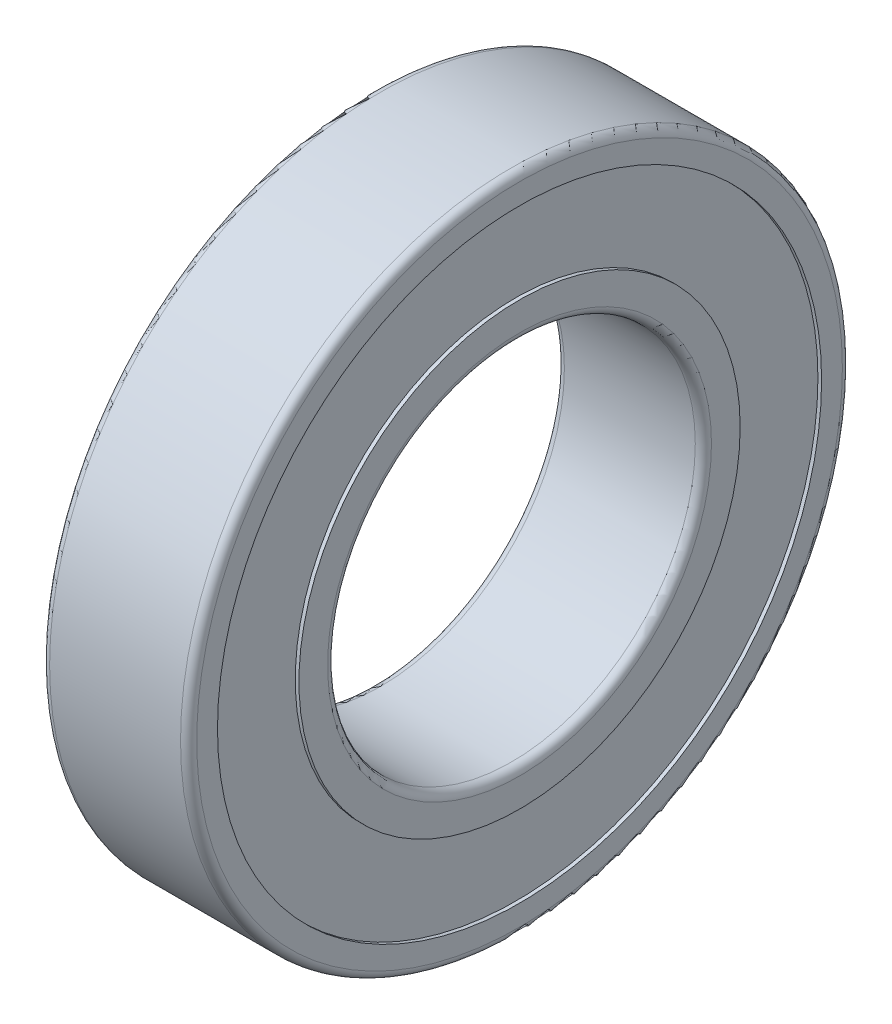
ISO-10303-21;
HEADER;
FILE_DESCRIPTION(('STEP AP214'),'2;1');
FILE_NAME('part.step','',(''),(''),'','','');
FILE_SCHEMA(('AUTOMOTIVE_DESIGN { 1 0 10303 214 1 1 1 1 }'));
ENDSEC;
DATA;
#1=APPLICATION_CONTEXT('core data for automotive mechanical design processes');
#2=APPLICATION_PROTOCOL_DEFINITION('international standard','automotive_design',2000,#1);
#3=PRODUCT_CONTEXT('',#1,'mechanical');
#4=PRODUCT('Part','Part','',(#3));
#5=PRODUCT_RELATED_PRODUCT_CATEGORY('part','',(#4));
#6=PRODUCT_DEFINITION_FORMATION('','',#4);
#7=PRODUCT_DEFINITION_CONTEXT('part definition',#1,'design');
#8=PRODUCT_DEFINITION('design','',#6,#7);
#9=PRODUCT_DEFINITION_SHAPE('','',#8);
#10=(LENGTH_UNIT() NAMED_UNIT(*) SI_UNIT(.MILLI.,.METRE.));
#11=(NAMED_UNIT(*) PLANE_ANGLE_UNIT() SI_UNIT($,.RADIAN.));
#12=(NAMED_UNIT(*) SI_UNIT($,.STERADIAN.) SOLID_ANGLE_UNIT());
#13=UNCERTAINTY_MEASURE_WITH_UNIT(LENGTH_MEASURE(1.E-05),#10,'distance_accuracy_value','');
#14=(GEOMETRIC_REPRESENTATION_CONTEXT(3) GLOBAL_UNCERTAINTY_ASSIGNED_CONTEXT((#13)) GLOBAL_UNIT_ASSIGNED_CONTEXT((#10,
#11,#12)) REPRESENTATION_CONTEXT('',''));
#15=CARTESIAN_POINT('',(0.,0.,0.));
#16=DIRECTION('',(0.,0.,1.));
#17=DIRECTION('',(1.,0.,0.));
#18=AXIS2_PLACEMENT_3D('',#15,#16,#17);
#19=CARTESIAN_POINT('',(0.,0.,0.));
#20=DIRECTION('',(-1.,0.,0.));
#21=DIRECTION('',(0.,0.,-1.));
#22=AXIS2_PLACEMENT_3D('',#19,#20,#21);
#23=CYLINDRICAL_SURFACE('',#22,25.);
#24=CARTESIAN_POINT('',(1.1,0.,0.));
#25=DIRECTION('',(-1.,0.,0.));
#26=DIRECTION('',(0.,0.,1.));
#27=AXIS2_PLACEMENT_3D('',#24,#25,#26);
#28=CIRCLE('',#27,25.);
#29=CARTESIAN_POINT('',(1.1,0.,25.));
#30=VERTEX_POINT('',#29);
#31=EDGE_CURVE('E56',#30,#30,#28,.F.);
#32=ORIENTED_EDGE('',*,*,#31,.F.);
#33=EDGE_LOOP('',(#32));
#34=FACE_BOUND('',#33,.T.);
#35=CARTESIAN_POINT('',(18.9,0.,0.));
#36=DIRECTION('',(1.,0.,0.));
#37=DIRECTION('',(0.,0.,-1.));
#38=AXIS2_PLACEMENT_3D('',#35,#36,#37);
#39=CIRCLE('',#38,25.);
#40=CARTESIAN_POINT('',(18.9,0.,-25.));
#41=VERTEX_POINT('',#40);
#42=EDGE_CURVE('E59',#41,#41,#39,.F.);
#43=ORIENTED_EDGE('',*,*,#42,.F.);
#44=EDGE_LOOP('',(#43));
#45=FACE_BOUND('',#44,.T.);
#46=ADVANCED_FACE('F30',(#34,#45),#23,.F.);
#47=CARTESIAN_POINT('',(0.,25.,0.));
#48=DIRECTION('',(1.,0.,0.));
#49=DIRECTION('',(0.,0.,1.));
#50=AXIS2_PLACEMENT_3D('',#47,#48,#49);
#51=PLANE('',#50);
#52=CARTESIAN_POINT('',(0.,0.,0.));
#53=DIRECTION('',(-1.,0.,0.));
#54=DIRECTION('',(0.,0.,1.));
#55=AXIS2_PLACEMENT_3D('',#52,#53,#54);
#56=CIRCLE('',#55,26.1);
#57=CARTESIAN_POINT('',(0.,0.,26.1));
#58=VERTEX_POINT('',#57);
#59=EDGE_CURVE('E53',#58,#58,#56,.T.);
#60=ORIENTED_EDGE('',*,*,#59,.F.);
#61=EDGE_LOOP('',(#60));
#62=FACE_BOUND('',#61,.T.);
#63=CARTESIAN_POINT('',(0.,0.,0.));
#64=DIRECTION('',(1.,0.,0.));
#65=DIRECTION('',(0.,0.,-1.));
#66=AXIS2_PLACEMENT_3D('',#63,#64,#65);
#67=CIRCLE('',#66,30.);
#68=CARTESIAN_POINT('',(0.,0.,-30.));
#69=VERTEX_POINT('',#68);
#70=EDGE_CURVE('E62',#69,#69,#67,.T.);
#71=ORIENTED_EDGE('',*,*,#70,.F.);
#72=EDGE_LOOP('',(#71));
#73=FACE_BOUND('',#72,.T.);
#74=ADVANCED_FACE('F105',(#62,#73),#51,.F.);
#75=CARTESIAN_POINT('',(0.,0.,0.));
#76=DIRECTION('',(-1.,0.,0.));
#77=DIRECTION('',(0.,0.,-1.));
#78=AXIS2_PLACEMENT_3D('',#75,#76,#77);
#79=CYLINDRICAL_SURFACE('',#78,30.);
#80=ORIENTED_EDGE('',*,*,#70,.T.);
#81=EDGE_LOOP('',(#80));
#82=FACE_BOUND('',#81,.T.);
#83=CARTESIAN_POINT('',(0.5,0.,0.));
#84=DIRECTION('',(1.,0.,0.));
#85=DIRECTION('',(0.,0.,-1.));
#86=AXIS2_PLACEMENT_3D('',#83,#84,#85);
#87=CIRCLE('',#86,30.);
#88=CARTESIAN_POINT('',(0.5,0.,-30.));
#89=VERTEX_POINT('',#88);
#90=EDGE_CURVE('E65',#89,#89,#87,.T.);
#91=ORIENTED_EDGE('',*,*,#90,.F.);
#92=EDGE_LOOP('',(#91));
#93=FACE_BOUND('',#92,.T.);
#94=ADVANCED_FACE('F111',(#82,#93),#79,.T.);
#95=CARTESIAN_POINT('',(0.5,30.,0.));
#96=DIRECTION('',(1.,0.,0.));
#97=DIRECTION('',(0.,0.,1.));
#98=AXIS2_PLACEMENT_3D('',#95,#96,#97);
#99=PLANE('',#98);
#100=ORIENTED_EDGE('',*,*,#90,.T.);
#101=EDGE_LOOP('',(#100));
#102=FACE_BOUND('',#101,.T.);
#103=CARTESIAN_POINT('',(0.5,0.,0.));
#104=DIRECTION('',(1.,0.,0.));
#105=DIRECTION('',(0.,0.,-1.));
#106=AXIS2_PLACEMENT_3D('',#103,#104,#105);
#107=CIRCLE('',#106,41.075);
#108=CARTESIAN_POINT('',(0.5,0.,-41.075));
#109=VERTEX_POINT('',#108);
#110=EDGE_CURVE('E68',#109,#109,#107,.T.);
#111=ORIENTED_EDGE('',*,*,#110,.F.);
#112=EDGE_LOOP('',(#111));
#113=FACE_BOUND('',#112,.T.);
#114=ADVANCED_FACE('F153',(#102,#113),#99,.F.);
#115=CARTESIAN_POINT('',(0.,0.,0.));
#116=DIRECTION('',(-1.,0.,0.));
#117=DIRECTION('',(0.,0.,-1.));
#118=AXIS2_PLACEMENT_3D('',#115,#116,#117);
#119=CYLINDRICAL_SURFACE('',#118,41.075);
#120=ORIENTED_EDGE('',*,*,#110,.T.);
#121=EDGE_LOOP('',(#120));
#122=FACE_BOUND('',#121,.T.);
#123=CARTESIAN_POINT('',(0.,0.,0.));
#124=DIRECTION('',(1.,0.,0.));
#125=DIRECTION('',(0.,0.,-1.));
#126=AXIS2_PLACEMENT_3D('',#123,#124,#125);
#127=CIRCLE('',#126,41.075);
#128=CARTESIAN_POINT('',(0.,0.,-41.075));
#129=VERTEX_POINT('',#128);
#130=EDGE_CURVE('E71',#129,#129,#127,.T.);
#131=ORIENTED_EDGE('',*,*,#130,.F.);
#132=EDGE_LOOP('',(#131));
#133=FACE_BOUND('',#132,.T.);
#134=ADVANCED_FACE('F146',(#122,#133),#119,.F.);
#135=CARTESIAN_POINT('',(0.,41.075,0.));
#136=DIRECTION('',(1.,0.,0.));
#137=DIRECTION('',(0.,0.,1.));
#138=AXIS2_PLACEMENT_3D('',#135,#136,#137);
#139=PLANE('',#138);
#140=CARTESIAN_POINT('',(0.,0.,0.));
#141=DIRECTION('',(-1.,0.,0.));
#142=DIRECTION('',(0.,0.,1.));
#143=AXIS2_PLACEMENT_3D('',#140,#141,#142);
#144=CIRCLE('',#143,43.9);
#145=CARTESIAN_POINT('',(0.,0.,43.9));
#146=VERTEX_POINT('',#145);
#147=EDGE_CURVE('E10',#146,#146,#144,.F.);
#148=ORIENTED_EDGE('',*,*,#147,.F.);
#149=EDGE_LOOP('',(#148));
#150=FACE_BOUND('',#149,.T.);
#151=ORIENTED_EDGE('',*,*,#130,.T.);
#152=EDGE_LOOP('',(#151));
#153=FACE_BOUND('',#152,.T.);
#154=ADVANCED_FACE('F137',(#150,#153),#139,.F.);
#155=CARTESIAN_POINT('',(0.,0.,0.));
#156=DIRECTION('',(-1.,0.,0.));
#157=DIRECTION('',(0.,0.,-1.));
#158=AXIS2_PLACEMENT_3D('',#155,#156,#157);
#159=CYLINDRICAL_SURFACE('',#158,45.);
#160=CARTESIAN_POINT('',(18.9,0.,0.));
#161=DIRECTION('',(1.,0.,0.));
#162=DIRECTION('',(0.,0.,-1.));
#163=AXIS2_PLACEMENT_3D('',#160,#161,#162);
#164=CIRCLE('',#163,45.);
#165=CARTESIAN_POINT('',(18.9,0.,-45.));
#166=VERTEX_POINT('',#165);
#167=EDGE_CURVE('E41',#166,#166,#164,.T.);
#168=ORIENTED_EDGE('',*,*,#167,.F.);
#169=EDGE_LOOP('',(#168));
#170=FACE_BOUND('',#169,.T.);
#171=CARTESIAN_POINT('',(1.1,0.,0.));
#172=DIRECTION('',(-1.,0.,0.));
#173=DIRECTION('',(0.,0.,1.));
#174=AXIS2_PLACEMENT_3D('',#171,#172,#173);
#175=CIRCLE('',#174,45.);
#176=CARTESIAN_POINT('',(1.1,0.,45.));
#177=VERTEX_POINT('',#176);
#178=EDGE_CURVE('E45',#177,#177,#175,.T.);
#179=ORIENTED_EDGE('',*,*,#178,.F.);
#180=EDGE_LOOP('',(#179));
#181=FACE_BOUND('',#180,.T.);
#182=ADVANCED_FACE('F133',(#170,#181),#159,.T.);
#183=CARTESIAN_POINT('',(20.,45.,0.));
#184=DIRECTION('',(-1.,0.,0.));
#185=DIRECTION('',(0.,0.,-1.));
#186=AXIS2_PLACEMENT_3D('',#183,#184,#185);
#187=PLANE('',#186);
#188=CARTESIAN_POINT('',(20.,0.,0.));
#189=DIRECTION('',(1.,0.,0.));
#190=DIRECTION('',(0.,0.,-1.));
#191=AXIS2_PLACEMENT_3D('',#188,#189,#190);
#192=CIRCLE('',#191,43.9);
#193=CARTESIAN_POINT('',(20.,0.,-43.9));
#194=VERTEX_POINT('',#193);
#195=EDGE_CURVE('E37',#194,#194,#192,.F.);
#196=ORIENTED_EDGE('',*,*,#195,.F.);
#197=EDGE_LOOP('',(#196));
#198=FACE_BOUND('',#197,.T.);
#199=CARTESIAN_POINT('',(20.,0.,0.));
#200=DIRECTION('',(1.,0.,0.));
#201=DIRECTION('',(0.,0.,-1.));
#202=AXIS2_PLACEMENT_3D('',#199,#200,#201);
#203=CIRCLE('',#202,41.075);
#204=CARTESIAN_POINT('',(20.,0.,-41.075));
#205=VERTEX_POINT('',#204);
#206=EDGE_CURVE('E74',#205,#205,#203,.T.);
#207=ORIENTED_EDGE('',*,*,#206,.F.);
#208=EDGE_LOOP('',(#207));
#209=FACE_BOUND('',#208,.T.);
#210=ADVANCED_FACE('F136',(#198,#209),#187,.F.);
#211=CARTESIAN_POINT('',(0.,0.,0.));
#212=DIRECTION('',(-1.,0.,0.));
#213=DIRECTION('',(0.,0.,-1.));
#214=AXIS2_PLACEMENT_3D('',#211,#212,#213);
#215=CYLINDRICAL_SURFACE('',#214,41.075);
#216=ORIENTED_EDGE('',*,*,#206,.T.);
#217=EDGE_LOOP('',(#216));
#218=FACE_BOUND('',#217,.T.);
#219=CARTESIAN_POINT('',(19.5,0.,0.));
#220=DIRECTION('',(1.,0.,0.));
#221=DIRECTION('',(0.,0.,-1.));
#222=AXIS2_PLACEMENT_3D('',#219,#220,#221);
#223=CIRCLE('',#222,41.075);
#224=CARTESIAN_POINT('',(19.5,0.,-41.075));
#225=VERTEX_POINT('',#224);
#226=EDGE_CURVE('E77',#225,#225,#223,.T.);
#227=ORIENTED_EDGE('',*,*,#226,.F.);
#228=EDGE_LOOP('',(#227));
#229=FACE_BOUND('',#228,.T.);
#230=ADVANCED_FACE('F101',(#218,#229),#215,.F.);
#231=CARTESIAN_POINT('',(19.5,41.075,0.));
#232=DIRECTION('',(-1.,0.,0.));
#233=DIRECTION('',(0.,0.,-1.));
#234=AXIS2_PLACEMENT_3D('',#231,#232,#233);
#235=PLANE('',#234);
#236=ORIENTED_EDGE('',*,*,#226,.T.);
#237=EDGE_LOOP('',(#236));
#238=FACE_BOUND('',#237,.T.);
#239=CARTESIAN_POINT('',(19.5,0.,0.));
#240=DIRECTION('',(1.,0.,0.));
#241=DIRECTION('',(0.,0.,-1.));
#242=AXIS2_PLACEMENT_3D('',#239,#240,#241);
#243=CIRCLE('',#242,30.);
#244=CARTESIAN_POINT('',(19.5,0.,-30.));
#245=VERTEX_POINT('',#244);
#246=EDGE_CURVE('E80',#245,#245,#243,.T.);
#247=ORIENTED_EDGE('',*,*,#246,.F.);
#248=EDGE_LOOP('',(#247));
#249=FACE_BOUND('',#248,.T.);
#250=ADVANCED_FACE('F91',(#238,#249),#235,.F.);
#251=CARTESIAN_POINT('',(0.,0.,0.));
#252=DIRECTION('',(-1.,0.,0.));
#253=DIRECTION('',(0.,0.,-1.));
#254=AXIS2_PLACEMENT_3D('',#251,#252,#253);
#255=CYLINDRICAL_SURFACE('',#254,30.);
#256=ORIENTED_EDGE('',*,*,#246,.T.);
#257=EDGE_LOOP('',(#256));
#258=FACE_BOUND('',#257,.T.);
#259=CARTESIAN_POINT('',(20.,0.,0.));
#260=DIRECTION('',(1.,0.,0.));
#261=DIRECTION('',(0.,0.,-1.));
#262=AXIS2_PLACEMENT_3D('',#259,#260,#261);
#263=CIRCLE('',#262,30.);
#264=CARTESIAN_POINT('',(20.,0.,-30.));
#265=VERTEX_POINT('',#264);
#266=EDGE_CURVE('E83',#265,#265,#263,.T.);
#267=ORIENTED_EDGE('',*,*,#266,.F.);
#268=EDGE_LOOP('',(#267));
#269=FACE_BOUND('',#268,.T.);
#270=ADVANCED_FACE('F89',(#258,#269),#255,.T.);
#271=CARTESIAN_POINT('',(20.,30.,0.));
#272=DIRECTION('',(-1.,0.,0.));
#273=DIRECTION('',(0.,0.,-1.));
#274=AXIS2_PLACEMENT_3D('',#271,#272,#273);
#275=PLANE('',#274);
#276=CARTESIAN_POINT('',(20.,0.,0.));
#277=DIRECTION('',(1.,0.,0.));
#278=DIRECTION('',(0.,0.,-1.));
#279=AXIS2_PLACEMENT_3D('',#276,#277,#278);
#280=CIRCLE('',#279,26.1);
#281=CARTESIAN_POINT('',(20.,0.,-26.1));
#282=VERTEX_POINT('',#281);
#283=EDGE_CURVE('E50',#282,#282,#280,.T.);
#284=ORIENTED_EDGE('',*,*,#283,.F.);
#285=EDGE_LOOP('',(#284));
#286=FACE_BOUND('',#285,.T.);
#287=ORIENTED_EDGE('',*,*,#266,.T.);
#288=EDGE_LOOP('',(#287));
#289=FACE_BOUND('',#288,.T.);
#290=ADVANCED_FACE('F87',(#286,#289),#275,.F.);
#291=CARTESIAN_POINT('',(1.1,0.,0.));
#292=DIRECTION('',(1.,0.,0.));
#293=DIRECTION('',(0.,0.,1.));
#294=AXIS2_PLACEMENT_3D('',#291,#292,#293);
#295=TOROIDAL_SURFACE('',#294,26.1,1.1);
#296=ORIENTED_EDGE('',*,*,#59,.T.);
#297=EDGE_LOOP('',(#296));
#298=FACE_BOUND('',#297,.T.);
#299=ORIENTED_EDGE('',*,*,#31,.T.);
#300=EDGE_LOOP('',(#299));
#301=FACE_BOUND('',#300,.T.);
#302=ADVANCED_FACE('F98',(#298,#301),#295,.T.);
#303=CARTESIAN_POINT('',(18.9,0.,0.));
#304=DIRECTION('',(-1.,0.,0.));
#305=DIRECTION('',(0.,0.,-1.));
#306=AXIS2_PLACEMENT_3D('',#303,#304,#305);
#307=TOROIDAL_SURFACE('',#306,26.1,1.1);
#308=ORIENTED_EDGE('',*,*,#42,.T.);
#309=EDGE_LOOP('',(#308));
#310=FACE_BOUND('',#309,.T.);
#311=ORIENTED_EDGE('',*,*,#283,.T.);
#312=EDGE_LOOP('',(#311));
#313=FACE_BOUND('',#312,.T.);
#314=ADVANCED_FACE('F120',(#310,#313),#307,.T.);
#315=CARTESIAN_POINT('',(18.9,0.,0.));
#316=DIRECTION('',(-1.,0.,0.));
#317=DIRECTION('',(0.,0.,-1.));
#318=AXIS2_PLACEMENT_3D('',#315,#316,#317);
#319=TOROIDAL_SURFACE('',#318,43.9,1.1);
#320=ORIENTED_EDGE('',*,*,#195,.T.);
#321=EDGE_LOOP('',(#320));
#322=FACE_BOUND('',#321,.T.);
#323=ORIENTED_EDGE('',*,*,#167,.T.);
#324=EDGE_LOOP('',(#323));
#325=FACE_BOUND('',#324,.T.);
#326=ADVANCED_FACE('F123',(#322,#325),#319,.T.);
#327=CARTESIAN_POINT('',(1.1,0.,0.));
#328=DIRECTION('',(1.,0.,0.));
#329=DIRECTION('',(0.,0.,1.));
#330=AXIS2_PLACEMENT_3D('',#327,#328,#329);
#331=TOROIDAL_SURFACE('',#330,43.9,1.1);
#332=ORIENTED_EDGE('',*,*,#178,.T.);
#333=EDGE_LOOP('',(#332));
#334=FACE_BOUND('',#333,.T.);
#335=ORIENTED_EDGE('',*,*,#147,.T.);
#336=EDGE_LOOP('',(#335));
#337=FACE_BOUND('',#336,.T.);
#338=ADVANCED_FACE('F32',(#334,#337),#331,.T.);
#339=CLOSED_SHELL('',(#46,#74,#94,#114,#134,#154,#182,#210,#230,#250,#270,#290,#302,#314,#326,#338));
#340=MANIFOLD_SOLID_BREP('B2',#339);
#341=ADVANCED_BREP_SHAPE_REPRESENTATION('',(#18,#340),#14);
#342=SHAPE_DEFINITION_REPRESENTATION(#9,#341);
ENDSEC;
END-ISO-10303-21;
